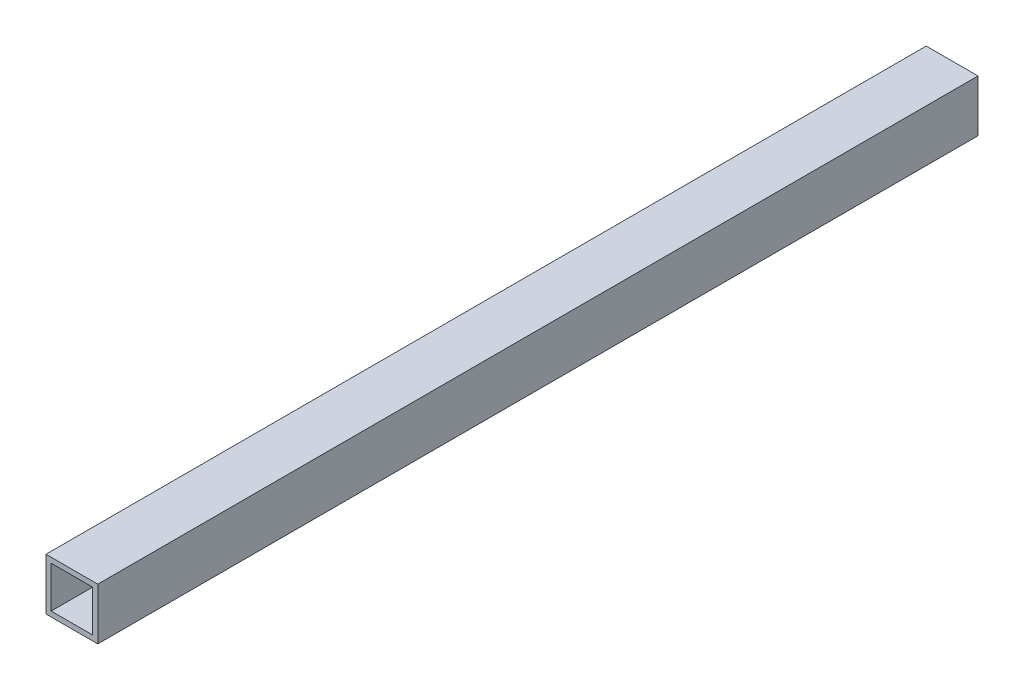
ISO-10303-21;
HEADER;
FILE_DESCRIPTION(('STEP AP214'),'2;1');
FILE_NAME('part.step','',(''),(''),'','','');
FILE_SCHEMA(('AUTOMOTIVE_DESIGN { 1 0 10303 214 1 1 1 1 }'));
ENDSEC;
DATA;
#1=APPLICATION_CONTEXT('core data for automotive mechanical design processes');
#2=APPLICATION_PROTOCOL_DEFINITION('international standard','automotive_design',2000,#1);
#3=PRODUCT_CONTEXT('',#1,'mechanical');
#4=PRODUCT('Part','Part','',(#3));
#5=PRODUCT_RELATED_PRODUCT_CATEGORY('part','',(#4));
#6=PRODUCT_DEFINITION_FORMATION('','',#4);
#7=PRODUCT_DEFINITION_CONTEXT('part definition',#1,'design');
#8=PRODUCT_DEFINITION('design','',#6,#7);
#9=PRODUCT_DEFINITION_SHAPE('','',#8);
#10=(LENGTH_UNIT() NAMED_UNIT(*) SI_UNIT(.MILLI.,.METRE.));
#11=(NAMED_UNIT(*) PLANE_ANGLE_UNIT() SI_UNIT($,.RADIAN.));
#12=(NAMED_UNIT(*) SI_UNIT($,.STERADIAN.) SOLID_ANGLE_UNIT());
#13=UNCERTAINTY_MEASURE_WITH_UNIT(LENGTH_MEASURE(1.E-05),#10,'distance_accuracy_value','');
#14=(GEOMETRIC_REPRESENTATION_CONTEXT(3) GLOBAL_UNCERTAINTY_ASSIGNED_CONTEXT((#13)) GLOBAL_UNIT_ASSIGNED_CONTEXT((#10,
#11,#12)) REPRESENTATION_CONTEXT('',''));
#15=CARTESIAN_POINT('',(0.,0.,0.));
#16=DIRECTION('',(0.,0.,1.));
#17=DIRECTION('',(1.,0.,0.));
#18=AXIS2_PLACEMENT_3D('',#15,#16,#17);
#19=CARTESIAN_POINT('',(0.,-10.,340.));
#20=DIRECTION('',(0.,1.,0.));
#21=DIRECTION('',(0.,0.,1.));
#22=AXIS2_PLACEMENT_3D('',#19,#20,#21);
#23=PLANE('',#22);
#24=DIRECTION('',(1.,0.,0.));
#25=VECTOR('',#24,1.);
#26=CARTESIAN_POINT('',(0.,-10.,0.));
#27=LINE('',#26,#25);
#28=CARTESIAN_POINT('',(-10.,-10.,0.));
#29=VERTEX_POINT('',#28);
#30=CARTESIAN_POINT('',(10.,-10.,0.));
#31=VERTEX_POINT('',#30);
#32=EDGE_CURVE('E148',#29,#31,#27,.T.);
#33=ORIENTED_EDGE('',*,*,#32,.T.);
#34=DIRECTION('',(0.,0.,-1.));
#35=VECTOR('',#34,1.);
#36=CARTESIAN_POINT('',(10.,-10.,340.));
#37=LINE('',#36,#35);
#38=CARTESIAN_POINT('',(10.,-10.,340.));
#39=VERTEX_POINT('',#38);
#40=EDGE_CURVE('E11',#39,#31,#37,.T.);
#41=ORIENTED_EDGE('',*,*,#40,.F.);
#42=DIRECTION('',(1.,0.,0.));
#43=VECTOR('',#42,1.);
#44=CARTESIAN_POINT('',(0.,-10.,340.));
#45=LINE('',#44,#43);
#46=CARTESIAN_POINT('',(-10.,-10.,340.));
#47=VERTEX_POINT('',#46);
#48=EDGE_CURVE('E120',#47,#39,#45,.T.);
#49=ORIENTED_EDGE('',*,*,#48,.F.);
#50=DIRECTION('',(0.,0.,-1.));
#51=VECTOR('',#50,1.);
#52=CARTESIAN_POINT('',(-10.,-10.,340.));
#53=LINE('',#52,#51);
#54=EDGE_CURVE('E60',#47,#29,#53,.T.);
#55=ORIENTED_EDGE('',*,*,#54,.T.);
#56=EDGE_LOOP('',(#33,#41,#49,#55));
#57=FACE_BOUND('',#56,.T.);
#58=ADVANCED_FACE('F41',(#57),#23,.F.);
#59=CARTESIAN_POINT('',(10.,0.,340.));
#60=DIRECTION('',(-1.,0.,0.));
#61=DIRECTION('',(0.,0.,1.));
#62=AXIS2_PLACEMENT_3D('',#59,#60,#61);
#63=PLANE('',#62);
#64=DIRECTION('',(0.,1.,0.));
#65=VECTOR('',#64,1.);
#66=CARTESIAN_POINT('',(10.,0.,0.));
#67=LINE('',#66,#65);
#68=CARTESIAN_POINT('',(10.,10.,0.));
#69=VERTEX_POINT('',#68);
#70=EDGE_CURVE('E126',#31,#69,#67,.T.);
#71=ORIENTED_EDGE('',*,*,#70,.T.);
#72=DIRECTION('',(0.,0.,-1.));
#73=VECTOR('',#72,1.);
#74=CARTESIAN_POINT('',(10.,10.,340.));
#75=LINE('',#74,#73);
#76=CARTESIAN_POINT('',(10.,10.,340.));
#77=VERTEX_POINT('',#76);
#78=EDGE_CURVE('E51',#77,#69,#75,.T.);
#79=ORIENTED_EDGE('',*,*,#78,.F.);
#80=DIRECTION('',(0.,1.,0.));
#81=VECTOR('',#80,1.);
#82=CARTESIAN_POINT('',(10.,0.,340.));
#83=LINE('',#82,#81);
#84=EDGE_CURVE('E114',#39,#77,#83,.T.);
#85=ORIENTED_EDGE('',*,*,#84,.F.);
#86=ORIENTED_EDGE('',*,*,#40,.T.);
#87=EDGE_LOOP('',(#71,#79,#85,#86));
#88=FACE_BOUND('',#87,.T.);
#89=ADVANCED_FACE('F125',(#88),#63,.F.);
#90=CARTESIAN_POINT('',(0.,10.,340.));
#91=DIRECTION('',(0.,1.,0.));
#92=DIRECTION('',(0.,0.,1.));
#93=AXIS2_PLACEMENT_3D('',#90,#91,#92);
#94=PLANE('',#93);
#95=DIRECTION('',(1.,0.,0.));
#96=VECTOR('',#95,1.);
#97=CARTESIAN_POINT('',(0.,10.,0.));
#98=LINE('',#97,#96);
#99=CARTESIAN_POINT('',(-10.,10.,0.));
#100=VERTEX_POINT('',#99);
#101=EDGE_CURVE('E151',#100,#69,#98,.T.);
#102=ORIENTED_EDGE('',*,*,#101,.F.);
#103=DIRECTION('',(0.,0.,-1.));
#104=VECTOR('',#103,1.);
#105=CARTESIAN_POINT('',(-10.,10.,340.));
#106=LINE('',#105,#104);
#107=CARTESIAN_POINT('',(-10.,10.,340.));
#108=VERTEX_POINT('',#107);
#109=EDGE_CURVE('E86',#108,#100,#106,.T.);
#110=ORIENTED_EDGE('',*,*,#109,.F.);
#111=DIRECTION('',(1.,0.,0.));
#112=VECTOR('',#111,1.);
#113=CARTESIAN_POINT('',(0.,10.,340.));
#114=LINE('',#113,#112);
#115=EDGE_CURVE('E119',#108,#77,#114,.T.);
#116=ORIENTED_EDGE('',*,*,#115,.T.);
#117=ORIENTED_EDGE('',*,*,#78,.T.);
#118=EDGE_LOOP('',(#102,#110,#116,#117));
#119=FACE_BOUND('',#118,.T.);
#120=ADVANCED_FACE('F130',(#119),#94,.T.);
#121=CARTESIAN_POINT('',(8.,0.,340.));
#122=DIRECTION('',(-1.,0.,0.));
#123=DIRECTION('',(0.,0.,1.));
#124=AXIS2_PLACEMENT_3D('',#121,#122,#123);
#125=PLANE('',#124);
#126=DIRECTION('',(0.,1.,0.));
#127=VECTOR('',#126,1.);
#128=CARTESIAN_POINT('',(8.,0.,0.));
#129=LINE('',#128,#127);
#130=CARTESIAN_POINT('',(8.,-8.,0.));
#131=VERTEX_POINT('',#130);
#132=CARTESIAN_POINT('',(8.,8.,0.));
#133=VERTEX_POINT('',#132);
#134=EDGE_CURVE('E137',#131,#133,#129,.T.);
#135=ORIENTED_EDGE('',*,*,#134,.F.);
#136=DIRECTION('',(0.,0.,-1.));
#137=VECTOR('',#136,1.);
#138=CARTESIAN_POINT('',(8.,-8.,340.));
#139=LINE('',#138,#137);
#140=CARTESIAN_POINT('',(8.,-8.,340.));
#141=VERTEX_POINT('',#140);
#142=EDGE_CURVE('E45',#141,#131,#139,.T.);
#143=ORIENTED_EDGE('',*,*,#142,.F.);
#144=DIRECTION('',(0.,1.,0.));
#145=VECTOR('',#144,1.);
#146=CARTESIAN_POINT('',(8.,0.,340.));
#147=LINE('',#146,#145);
#148=CARTESIAN_POINT('',(8.,8.,340.));
#149=VERTEX_POINT('',#148);
#150=EDGE_CURVE('E156',#141,#149,#147,.T.);
#151=ORIENTED_EDGE('',*,*,#150,.T.);
#152=DIRECTION('',(0.,0.,-1.));
#153=VECTOR('',#152,1.);
#154=CARTESIAN_POINT('',(8.,8.,340.));
#155=LINE('',#154,#153);
#156=EDGE_CURVE('E133',#149,#133,#155,.T.);
#157=ORIENTED_EDGE('',*,*,#156,.T.);
#158=EDGE_LOOP('',(#135,#143,#151,#157));
#159=FACE_BOUND('',#158,.T.);
#160=ADVANCED_FACE('F43',(#159),#125,.T.);
#161=CARTESIAN_POINT('',(0.,-8.,340.));
#162=DIRECTION('',(0.,1.,0.));
#163=DIRECTION('',(0.,0.,1.));
#164=AXIS2_PLACEMENT_3D('',#161,#162,#163);
#165=PLANE('',#164);
#166=DIRECTION('',(1.,0.,0.));
#167=VECTOR('',#166,1.);
#168=CARTESIAN_POINT('',(0.,-8.,0.));
#169=LINE('',#168,#167);
#170=CARTESIAN_POINT('',(-8.,-8.,0.));
#171=VERTEX_POINT('',#170);
#172=EDGE_CURVE('E140',#171,#131,#169,.T.);
#173=ORIENTED_EDGE('',*,*,#172,.F.);
#174=DIRECTION('',(0.,0.,-1.));
#175=VECTOR('',#174,1.);
#176=CARTESIAN_POINT('',(-8.,-8.,340.));
#177=LINE('',#176,#175);
#178=CARTESIAN_POINT('',(-8.,-8.,340.));
#179=VERTEX_POINT('',#178);
#180=EDGE_CURVE('E162',#179,#171,#177,.T.);
#181=ORIENTED_EDGE('',*,*,#180,.F.);
#182=DIRECTION('',(1.,0.,0.));
#183=VECTOR('',#182,1.);
#184=CARTESIAN_POINT('',(0.,-8.,340.));
#185=LINE('',#184,#183);
#186=EDGE_CURVE('E171',#179,#141,#185,.T.);
#187=ORIENTED_EDGE('',*,*,#186,.T.);
#188=ORIENTED_EDGE('',*,*,#142,.T.);
#189=EDGE_LOOP('',(#173,#181,#187,#188));
#190=FACE_BOUND('',#189,.T.);
#191=ADVANCED_FACE('F169',(#190),#165,.T.);
#192=CARTESIAN_POINT('',(-8.,0.,340.));
#193=DIRECTION('',(-1.,0.,0.));
#194=DIRECTION('',(0.,0.,1.));
#195=AXIS2_PLACEMENT_3D('',#192,#193,#194);
#196=PLANE('',#195);
#197=DIRECTION('',(0.,1.,0.));
#198=VECTOR('',#197,1.);
#199=CARTESIAN_POINT('',(-8.,0.,0.));
#200=LINE('',#199,#198);
#201=CARTESIAN_POINT('',(-8.,8.,0.));
#202=VERTEX_POINT('',#201);
#203=EDGE_CURVE('E143',#171,#202,#200,.T.);
#204=ORIENTED_EDGE('',*,*,#203,.T.);
#205=DIRECTION('',(0.,0.,-1.));
#206=VECTOR('',#205,1.);
#207=CARTESIAN_POINT('',(-8.,8.,340.));
#208=LINE('',#207,#206);
#209=CARTESIAN_POINT('',(-8.,8.,340.));
#210=VERTEX_POINT('',#209);
#211=EDGE_CURVE('E160',#210,#202,#208,.T.);
#212=ORIENTED_EDGE('',*,*,#211,.F.);
#213=DIRECTION('',(0.,1.,0.));
#214=VECTOR('',#213,1.);
#215=CARTESIAN_POINT('',(-8.,0.,340.));
#216=LINE('',#215,#214);
#217=EDGE_CURVE('E184',#179,#210,#216,.T.);
#218=ORIENTED_EDGE('',*,*,#217,.F.);
#219=ORIENTED_EDGE('',*,*,#180,.T.);
#220=EDGE_LOOP('',(#204,#212,#218,#219));
#221=FACE_BOUND('',#220,.T.);
#222=ADVANCED_FACE('F178',(#221),#196,.F.);
#223=CARTESIAN_POINT('',(0.,8.,340.));
#224=DIRECTION('',(0.,1.,0.));
#225=DIRECTION('',(0.,0.,1.));
#226=AXIS2_PLACEMENT_3D('',#223,#224,#225);
#227=PLANE('',#226);
#228=DIRECTION('',(1.,0.,0.));
#229=VECTOR('',#228,1.);
#230=CARTESIAN_POINT('',(0.,8.,0.));
#231=LINE('',#230,#229);
#232=EDGE_CURVE('E145',#202,#133,#231,.T.);
#233=ORIENTED_EDGE('',*,*,#232,.T.);
#234=ORIENTED_EDGE('',*,*,#156,.F.);
#235=DIRECTION('',(1.,0.,0.));
#236=VECTOR('',#235,1.);
#237=CARTESIAN_POINT('',(0.,8.,340.));
#238=LINE('',#237,#236);
#239=EDGE_CURVE('E182',#210,#149,#238,.T.);
#240=ORIENTED_EDGE('',*,*,#239,.F.);
#241=ORIENTED_EDGE('',*,*,#211,.T.);
#242=EDGE_LOOP('',(#233,#234,#240,#241));
#243=FACE_BOUND('',#242,.T.);
#244=ADVANCED_FACE('F181',(#243),#227,.F.);
#245=CARTESIAN_POINT('',(-10.,0.,340.));
#246=DIRECTION('',(-1.,0.,0.));
#247=DIRECTION('',(0.,0.,1.));
#248=AXIS2_PLACEMENT_3D('',#245,#246,#247);
#249=PLANE('',#248);
#250=DIRECTION('',(0.,1.,0.));
#251=VECTOR('',#250,1.);
#252=CARTESIAN_POINT('',(-10.,0.,0.));
#253=LINE('',#252,#251);
#254=EDGE_CURVE('E153',#29,#100,#253,.T.);
#255=ORIENTED_EDGE('',*,*,#254,.F.);
#256=ORIENTED_EDGE('',*,*,#54,.F.);
#257=DIRECTION('',(0.,1.,0.));
#258=VECTOR('',#257,1.);
#259=CARTESIAN_POINT('',(-10.,0.,340.));
#260=LINE('',#259,#258);
#261=EDGE_CURVE('E131',#47,#108,#260,.T.);
#262=ORIENTED_EDGE('',*,*,#261,.T.);
#263=ORIENTED_EDGE('',*,*,#109,.T.);
#264=EDGE_LOOP('',(#255,#256,#262,#263));
#265=FACE_BOUND('',#264,.T.);
#266=ADVANCED_FACE('F190',(#265),#249,.T.);
#267=CARTESIAN_POINT('',(0.,0.,340.));
#268=DIRECTION('',(0.,0.,1.));
#269=DIRECTION('',(1.,0.,0.));
#270=AXIS2_PLACEMENT_3D('',#267,#268,#269);
#271=PLANE('',#270);
#272=ORIENTED_EDGE('',*,*,#150,.F.);
#273=ORIENTED_EDGE('',*,*,#186,.F.);
#274=ORIENTED_EDGE('',*,*,#217,.T.);
#275=ORIENTED_EDGE('',*,*,#239,.T.);
#276=EDGE_LOOP('',(#272,#273,#274,#275));
#277=FACE_BOUND('',#276,.T.);
#278=ORIENTED_EDGE('',*,*,#48,.T.);
#279=ORIENTED_EDGE('',*,*,#84,.T.);
#280=ORIENTED_EDGE('',*,*,#115,.F.);
#281=ORIENTED_EDGE('',*,*,#261,.F.);
#282=EDGE_LOOP('',(#278,#279,#280,#281));
#283=FACE_BOUND('',#282,.T.);
#284=ADVANCED_FACE('F116',(#277,#283),#271,.T.);
#285=CARTESIAN_POINT('',(0.,0.,0.));
#286=DIRECTION('',(0.,0.,1.));
#287=DIRECTION('',(1.,0.,0.));
#288=AXIS2_PLACEMENT_3D('',#285,#286,#287);
#289=PLANE('',#288);
#290=ORIENTED_EDGE('',*,*,#134,.T.);
#291=ORIENTED_EDGE('',*,*,#232,.F.);
#292=ORIENTED_EDGE('',*,*,#203,.F.);
#293=ORIENTED_EDGE('',*,*,#172,.T.);
#294=EDGE_LOOP('',(#290,#291,#292,#293));
#295=FACE_BOUND('',#294,.T.);
#296=ORIENTED_EDGE('',*,*,#32,.F.);
#297=ORIENTED_EDGE('',*,*,#254,.T.);
#298=ORIENTED_EDGE('',*,*,#101,.T.);
#299=ORIENTED_EDGE('',*,*,#70,.F.);
#300=EDGE_LOOP('',(#296,#297,#298,#299));
#301=FACE_BOUND('',#300,.T.);
#302=ADVANCED_FACE('F175',(#295,#301),#289,.F.);
#303=CLOSED_SHELL('',(#58,#89,#120,#160,#191,#222,#244,#266,#284,#302));
#304=MANIFOLD_SOLID_BREP('B2',#303);
#305=ADVANCED_BREP_SHAPE_REPRESENTATION('',(#18,#304),#14);
#306=SHAPE_DEFINITION_REPRESENTATION(#9,#305);
ENDSEC;
END-ISO-10303-21;
